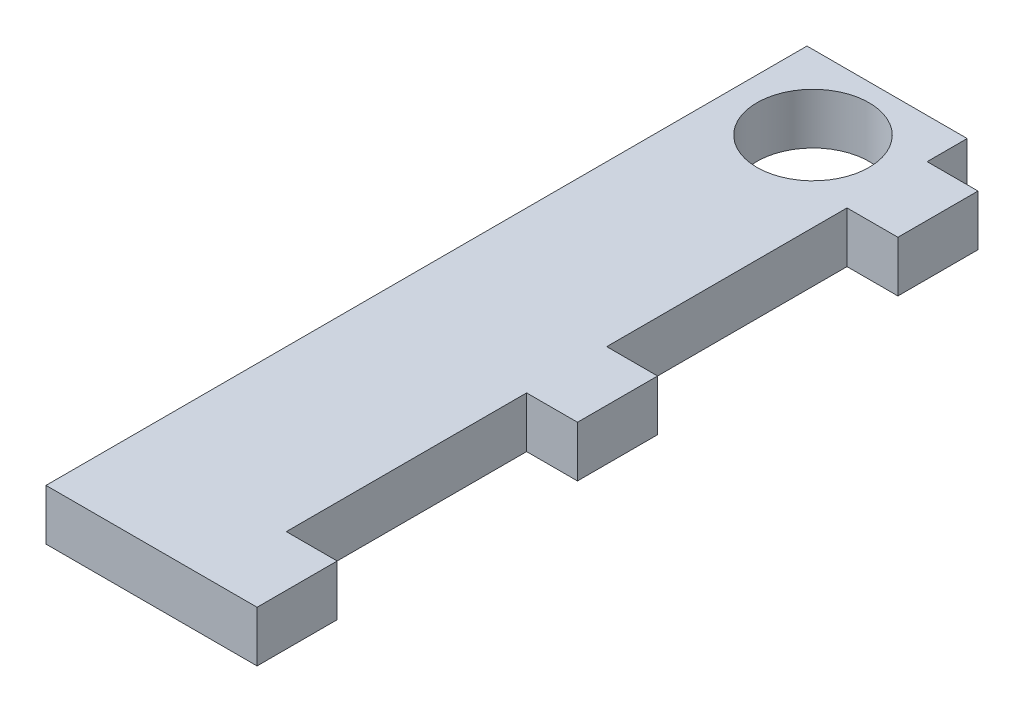
ISO-10303-21;
HEADER;
FILE_DESCRIPTION(('STEP AP214'),'2;1');
FILE_NAME('part.step','',(''),(''),'','','');
FILE_SCHEMA(('AUTOMOTIVE_DESIGN { 1 0 10303 214 1 1 1 1 }'));
ENDSEC;
DATA;
#1=APPLICATION_CONTEXT('core data for automotive mechanical design processes');
#2=APPLICATION_PROTOCOL_DEFINITION('international standard','automotive_design',2000,#1);
#3=PRODUCT_CONTEXT('',#1,'mechanical');
#4=PRODUCT('Part','Part','',(#3));
#5=PRODUCT_RELATED_PRODUCT_CATEGORY('part','',(#4));
#6=PRODUCT_DEFINITION_FORMATION('','',#4);
#7=PRODUCT_DEFINITION_CONTEXT('part definition',#1,'design');
#8=PRODUCT_DEFINITION('design','',#6,#7);
#9=PRODUCT_DEFINITION_SHAPE('','',#8);
#10=(LENGTH_UNIT() NAMED_UNIT(*) SI_UNIT(.MILLI.,.METRE.));
#11=(NAMED_UNIT(*) PLANE_ANGLE_UNIT() SI_UNIT($,.RADIAN.));
#12=(NAMED_UNIT(*) SI_UNIT($,.STERADIAN.) SOLID_ANGLE_UNIT());
#13=UNCERTAINTY_MEASURE_WITH_UNIT(LENGTH_MEASURE(1.E-05),#10,'distance_accuracy_value','');
#14=(GEOMETRIC_REPRESENTATION_CONTEXT(3) GLOBAL_UNCERTAINTY_ASSIGNED_CONTEXT((#13)) GLOBAL_UNIT_ASSIGNED_CONTEXT((#10,
#11,#12)) REPRESENTATION_CONTEXT('',''));
#15=CARTESIAN_POINT('',(0.,0.,0.));
#16=DIRECTION('',(0.,0.,1.));
#17=DIRECTION('',(1.,0.,0.));
#18=AXIS2_PLACEMENT_3D('',#15,#16,#17);
#19=CARTESIAN_POINT('',(0.,3.175,0.));
#20=DIRECTION('',(0.,1.,0.));
#21=DIRECTION('',(0.,0.,1.));
#22=AXIS2_PLACEMENT_3D('',#19,#20,#21);
#23=PLANE('',#22);
#24=DIRECTION('',(1.,0.,0.));
#25=VECTOR('',#24,1.);
#26=CARTESIAN_POINT('',(-13.175,3.175,47.5));
#27=LINE('',#26,#25);
#28=CARTESIAN_POINT('',(-13.175,3.175,47.5));
#29=VERTEX_POINT('',#28);
#30=CARTESIAN_POINT('',(13.175,3.175,47.5));
#31=VERTEX_POINT('',#30);
#32=EDGE_CURVE('E196',#29,#31,#27,.T.);
#33=ORIENTED_EDGE('',*,*,#32,.T.);
#34=DIRECTION('',(0.,0.,-1.));
#35=VECTOR('',#34,1.);
#36=CARTESIAN_POINT('',(13.175,3.175,47.5));
#37=LINE('',#36,#35);
#38=CARTESIAN_POINT('',(13.175,3.175,37.5));
#39=VERTEX_POINT('',#38);
#40=EDGE_CURVE('E114',#31,#39,#37,.T.);
#41=ORIENTED_EDGE('',*,*,#40,.T.);
#42=DIRECTION('',(-1.,0.,0.));
#43=VECTOR('',#42,1.);
#44=CARTESIAN_POINT('',(13.175,3.175,37.5));
#45=LINE('',#44,#43);
#46=CARTESIAN_POINT('',(6.82499999999999,3.175,37.5));
#47=VERTEX_POINT('',#46);
#48=EDGE_CURVE('E229',#39,#47,#45,.T.);
#49=ORIENTED_EDGE('',*,*,#48,.T.);
#50=DIRECTION('',(0.,0.,-1.));
#51=VECTOR('',#50,1.);
#52=CARTESIAN_POINT('',(6.82499999999999,3.175,37.5));
#53=LINE('',#52,#51);
#54=CARTESIAN_POINT('',(6.82499999999999,3.175,7.49999999999999));
#55=VERTEX_POINT('',#54);
#56=EDGE_CURVE('E248',#47,#55,#53,.T.);
#57=ORIENTED_EDGE('',*,*,#56,.T.);
#58=DIRECTION('',(1.,0.,0.));
#59=VECTOR('',#58,1.);
#60=CARTESIAN_POINT('',(6.82499999999999,3.175,7.49999999999999));
#61=LINE('',#60,#59);
#62=CARTESIAN_POINT('',(13.175,3.175,7.49999999999999));
#63=VERTEX_POINT('',#62);
#64=EDGE_CURVE('E245',#55,#63,#61,.T.);
#65=ORIENTED_EDGE('',*,*,#64,.T.);
#66=DIRECTION('',(0.,0.,-1.));
#67=VECTOR('',#66,1.);
#68=CARTESIAN_POINT('',(13.175,3.175,7.49999999999999));
#69=LINE('',#68,#67);
#70=CARTESIAN_POINT('',(13.175,3.175,-2.50000000000002));
#71=VERTEX_POINT('',#70);
#72=EDGE_CURVE('E247',#63,#71,#69,.T.);
#73=ORIENTED_EDGE('',*,*,#72,.T.);
#74=DIRECTION('',(-1.,0.,0.));
#75=VECTOR('',#74,1.);
#76=CARTESIAN_POINT('',(13.175,3.175,-2.50000000000002));
#77=LINE('',#76,#75);
#78=CARTESIAN_POINT('',(6.82499999999999,3.175,-2.50000000000002));
#79=VERTEX_POINT('',#78);
#80=EDGE_CURVE('E250',#71,#79,#77,.T.);
#81=ORIENTED_EDGE('',*,*,#80,.T.);
#82=DIRECTION('',(0.,0.,-1.));
#83=VECTOR('',#82,1.);
#84=CARTESIAN_POINT('',(6.82499999999999,3.175,-2.50000000000002));
#85=LINE('',#84,#83);
#86=CARTESIAN_POINT('',(6.82499999999999,3.175,-32.5));
#87=VERTEX_POINT('',#86);
#88=EDGE_CURVE('E256',#79,#87,#85,.T.);
#89=ORIENTED_EDGE('',*,*,#88,.T.);
#90=DIRECTION('',(1.,0.,0.));
#91=VECTOR('',#90,1.);
#92=CARTESIAN_POINT('',(6.82499999999999,3.175,-32.5));
#93=LINE('',#92,#91);
#94=CARTESIAN_POINT('',(13.175,3.175,-32.5));
#95=VERTEX_POINT('',#94);
#96=EDGE_CURVE('E258',#87,#95,#93,.T.);
#97=ORIENTED_EDGE('',*,*,#96,.T.);
#98=DIRECTION('',(0.,0.,-1.));
#99=VECTOR('',#98,1.);
#100=CARTESIAN_POINT('',(13.175,3.175,-32.5));
#101=LINE('',#100,#99);
#102=CARTESIAN_POINT('',(13.175,3.175,-42.5));
#103=VERTEX_POINT('',#102);
#104=EDGE_CURVE('E260',#95,#103,#101,.T.);
#105=ORIENTED_EDGE('',*,*,#104,.T.);
#106=DIRECTION('',(-1.,0.,0.));
#107=VECTOR('',#106,1.);
#108=CARTESIAN_POINT('',(13.175,3.175,-42.5));
#109=LINE('',#108,#107);
#110=CARTESIAN_POINT('',(6.82499999999999,3.175,-42.5));
#111=VERTEX_POINT('',#110);
#112=EDGE_CURVE('E151',#103,#111,#109,.T.);
#113=ORIENTED_EDGE('',*,*,#112,.T.);
#114=DIRECTION('',(0.,0.,-1.));
#115=VECTOR('',#114,1.);
#116=CARTESIAN_POINT('',(6.82499999999999,3.175,-42.5));
#117=LINE('',#116,#115);
#118=CARTESIAN_POINT('',(6.82499999999999,3.175,-47.5));
#119=VERTEX_POINT('',#118);
#120=EDGE_CURVE('E145',#111,#119,#117,.T.);
#121=ORIENTED_EDGE('',*,*,#120,.T.);
#122=DIRECTION('',(-1.,0.,0.));
#123=VECTOR('',#122,1.);
#124=CARTESIAN_POINT('',(6.82499999999999,3.175,-47.5));
#125=LINE('',#124,#123);
#126=CARTESIAN_POINT('',(-13.175,3.175,-47.5));
#127=VERTEX_POINT('',#126);
#128=EDGE_CURVE('E149',#119,#127,#125,.T.);
#129=ORIENTED_EDGE('',*,*,#128,.T.);
#130=DIRECTION('',(0.,0.,1.));
#131=VECTOR('',#130,1.);
#132=CARTESIAN_POINT('',(-13.175,3.175,-47.5));
#133=LINE('',#132,#131);
#134=EDGE_CURVE('E53',#127,#29,#133,.T.);
#135=ORIENTED_EDGE('',*,*,#134,.T.);
#136=EDGE_LOOP('',(#33,#41,#49,#57,#65,#73,#81,#89,#97,#105,#113,#121,#129,#135));
#137=FACE_BOUND('',#136,.T.);
#138=CARTESIAN_POINT('',(-3.17500000000001,3.175,-38.25));
#139=DIRECTION('',(0.,1.,0.));
#140=DIRECTION('',(0.,0.,1.));
#141=AXIS2_PLACEMENT_3D('',#138,#139,#140);
#142=CIRCLE('',#141,7.);
#143=CARTESIAN_POINT('',(-3.17500000000001,3.175,-31.25));
#144=VERTEX_POINT('',#143);
#145=EDGE_CURVE('E173',#144,#144,#142,.T.);
#146=ORIENTED_EDGE('',*,*,#145,.F.);
#147=EDGE_LOOP('',(#146));
#148=FACE_BOUND('',#147,.T.);
#149=ADVANCED_FACE('F36',(#137,#148),#23,.T.);
#150=CARTESIAN_POINT('',(0.,-3.175,0.));
#151=DIRECTION('',(0.,1.,0.));
#152=DIRECTION('',(0.,0.,1.));
#153=AXIS2_PLACEMENT_3D('',#150,#151,#152);
#154=PLANE('',#153);
#155=DIRECTION('',(1.,0.,0.));
#156=VECTOR('',#155,1.);
#157=CARTESIAN_POINT('',(-13.175,-3.175,47.5));
#158=LINE('',#157,#156);
#159=CARTESIAN_POINT('',(-13.175,-3.175,47.5));
#160=VERTEX_POINT('',#159);
#161=CARTESIAN_POINT('',(13.175,-3.175,47.5));
#162=VERTEX_POINT('',#161);
#163=EDGE_CURVE('E169',#160,#162,#158,.T.);
#164=ORIENTED_EDGE('',*,*,#163,.F.);
#165=DIRECTION('',(0.,0.,1.));
#166=VECTOR('',#165,1.);
#167=CARTESIAN_POINT('',(-13.175,-3.175,-47.5));
#168=LINE('',#167,#166);
#169=CARTESIAN_POINT('',(-13.175,-3.175,-47.5));
#170=VERTEX_POINT('',#169);
#171=EDGE_CURVE('E106',#170,#160,#168,.T.);
#172=ORIENTED_EDGE('',*,*,#171,.F.);
#173=DIRECTION('',(-1.,0.,0.));
#174=VECTOR('',#173,1.);
#175=CARTESIAN_POINT('',(6.82499999999999,-3.175,-47.5));
#176=LINE('',#175,#174);
#177=CARTESIAN_POINT('',(6.82499999999999,-3.175,-47.5));
#178=VERTEX_POINT('',#177);
#179=EDGE_CURVE('E100',#178,#170,#176,.T.);
#180=ORIENTED_EDGE('',*,*,#179,.F.);
#181=DIRECTION('',(0.,0.,-1.));
#182=VECTOR('',#181,1.);
#183=CARTESIAN_POINT('',(6.82499999999999,-3.175,-42.5));
#184=LINE('',#183,#182);
#185=CARTESIAN_POINT('',(6.82499999999999,-3.175,-42.5));
#186=VERTEX_POINT('',#185);
#187=EDGE_CURVE('E159',#186,#178,#184,.T.);
#188=ORIENTED_EDGE('',*,*,#187,.F.);
#189=DIRECTION('',(-1.,0.,0.));
#190=VECTOR('',#189,1.);
#191=CARTESIAN_POINT('',(13.175,-3.175,-42.5));
#192=LINE('',#191,#190);
#193=CARTESIAN_POINT('',(13.175,-3.175,-42.5));
#194=VERTEX_POINT('',#193);
#195=EDGE_CURVE('E191',#194,#186,#192,.T.);
#196=ORIENTED_EDGE('',*,*,#195,.F.);
#197=DIRECTION('',(0.,0.,-1.));
#198=VECTOR('',#197,1.);
#199=CARTESIAN_POINT('',(13.175,-3.175,-32.5));
#200=LINE('',#199,#198);
#201=CARTESIAN_POINT('',(13.175,-3.175,-32.5));
#202=VERTEX_POINT('',#201);
#203=EDGE_CURVE('E189',#202,#194,#200,.T.);
#204=ORIENTED_EDGE('',*,*,#203,.F.);
#205=DIRECTION('',(1.,0.,0.));
#206=VECTOR('',#205,1.);
#207=CARTESIAN_POINT('',(6.82499999999999,-3.175,-32.5));
#208=LINE('',#207,#206);
#209=CARTESIAN_POINT('',(6.82499999999999,-3.175,-32.5));
#210=VERTEX_POINT('',#209);
#211=EDGE_CURVE('E187',#210,#202,#208,.T.);
#212=ORIENTED_EDGE('',*,*,#211,.F.);
#213=DIRECTION('',(0.,0.,-1.));
#214=VECTOR('',#213,1.);
#215=CARTESIAN_POINT('',(6.82499999999999,-3.175,-2.50000000000002));
#216=LINE('',#215,#214);
#217=CARTESIAN_POINT('',(6.82499999999999,-3.175,-2.50000000000002));
#218=VERTEX_POINT('',#217);
#219=EDGE_CURVE('E185',#218,#210,#216,.T.);
#220=ORIENTED_EDGE('',*,*,#219,.F.);
#221=DIRECTION('',(-1.,0.,0.));
#222=VECTOR('',#221,1.);
#223=CARTESIAN_POINT('',(13.175,-3.175,-2.50000000000002));
#224=LINE('',#223,#222);
#225=CARTESIAN_POINT('',(13.175,-3.175,-2.50000000000002));
#226=VERTEX_POINT('',#225);
#227=EDGE_CURVE('E183',#226,#218,#224,.T.);
#228=ORIENTED_EDGE('',*,*,#227,.F.);
#229=DIRECTION('',(0.,0.,-1.));
#230=VECTOR('',#229,1.);
#231=CARTESIAN_POINT('',(13.175,-3.175,7.49999999999999));
#232=LINE('',#231,#230);
#233=CARTESIAN_POINT('',(13.175,-3.175,7.49999999999999));
#234=VERTEX_POINT('',#233);
#235=EDGE_CURVE('E181',#234,#226,#232,.T.);
#236=ORIENTED_EDGE('',*,*,#235,.F.);
#237=DIRECTION('',(1.,0.,0.));
#238=VECTOR('',#237,1.);
#239=CARTESIAN_POINT('',(6.82499999999999,-3.175,7.49999999999999));
#240=LINE('',#239,#238);
#241=CARTESIAN_POINT('',(6.82499999999999,-3.175,7.49999999999999));
#242=VERTEX_POINT('',#241);
#243=EDGE_CURVE('E179',#242,#234,#240,.T.);
#244=ORIENTED_EDGE('',*,*,#243,.F.);
#245=DIRECTION('',(0.,0.,-1.));
#246=VECTOR('',#245,1.);
#247=CARTESIAN_POINT('',(6.82499999999999,-3.175,37.5));
#248=LINE('',#247,#246);
#249=CARTESIAN_POINT('',(6.82499999999999,-3.175,37.5));
#250=VERTEX_POINT('',#249);
#251=EDGE_CURVE('E177',#250,#242,#248,.T.);
#252=ORIENTED_EDGE('',*,*,#251,.F.);
#253=DIRECTION('',(-1.,0.,0.));
#254=VECTOR('',#253,1.);
#255=CARTESIAN_POINT('',(13.175,-3.175,37.5));
#256=LINE('',#255,#254);
#257=CARTESIAN_POINT('',(13.175,-3.175,37.5));
#258=VERTEX_POINT('',#257);
#259=EDGE_CURVE('E175',#258,#250,#256,.T.);
#260=ORIENTED_EDGE('',*,*,#259,.F.);
#261=DIRECTION('',(0.,0.,-1.));
#262=VECTOR('',#261,1.);
#263=CARTESIAN_POINT('',(13.175,-3.175,47.5));
#264=LINE('',#263,#262);
#265=EDGE_CURVE('E172',#162,#258,#264,.T.);
#266=ORIENTED_EDGE('',*,*,#265,.F.);
#267=EDGE_LOOP('',(#164,#172,#180,#188,#196,#204,#212,#220,#228,#236,#244,#252,#260,#266));
#268=FACE_BOUND('',#267,.T.);
#269=CARTESIAN_POINT('',(-3.17500000000001,-3.175,-38.25));
#270=DIRECTION('',(0.,1.,0.));
#271=DIRECTION('',(0.,0.,1.));
#272=AXIS2_PLACEMENT_3D('',#269,#270,#271);
#273=CIRCLE('',#272,7.);
#274=CARTESIAN_POINT('',(-3.17500000000001,-3.175,-31.25));
#275=VERTEX_POINT('',#274);
#276=EDGE_CURVE('E433',#275,#275,#273,.T.);
#277=ORIENTED_EDGE('',*,*,#276,.T.);
#278=EDGE_LOOP('',(#277));
#279=FACE_BOUND('',#278,.T.);
#280=ADVANCED_FACE('F233',(#268,#279),#154,.F.);
#281=CARTESIAN_POINT('',(-13.175,3.175,47.5));
#282=DIRECTION('',(0.,0.,-1.));
#283=DIRECTION('',(-1.,0.,0.));
#284=AXIS2_PLACEMENT_3D('',#281,#282,#283);
#285=PLANE('',#284);
#286=ORIENTED_EDGE('',*,*,#163,.T.);
#287=DIRECTION('',(0.,-1.,0.));
#288=VECTOR('',#287,1.);
#289=CARTESIAN_POINT('',(13.175,3.175,47.5));
#290=LINE('',#289,#288);
#291=EDGE_CURVE('E11',#31,#162,#290,.T.);
#292=ORIENTED_EDGE('',*,*,#291,.F.);
#293=ORIENTED_EDGE('',*,*,#32,.F.);
#294=DIRECTION('',(0.,-1.,0.));
#295=VECTOR('',#294,1.);
#296=CARTESIAN_POINT('',(-13.175,3.175,47.5));
#297=LINE('',#296,#295);
#298=EDGE_CURVE('E165',#29,#160,#297,.T.);
#299=ORIENTED_EDGE('',*,*,#298,.T.);
#300=EDGE_LOOP('',(#286,#292,#293,#299));
#301=FACE_BOUND('',#300,.T.);
#302=ADVANCED_FACE('F38',(#301),#285,.F.);
#303=CARTESIAN_POINT('',(13.175,3.175,47.5));
#304=DIRECTION('',(-1.,0.,0.));
#305=DIRECTION('',(0.,0.,1.));
#306=AXIS2_PLACEMENT_3D('',#303,#304,#305);
#307=PLANE('',#306);
#308=ORIENTED_EDGE('',*,*,#265,.T.);
#309=DIRECTION('',(0.,-1.,0.));
#310=VECTOR('',#309,1.);
#311=CARTESIAN_POINT('',(13.175,3.175,37.5));
#312=LINE('',#311,#310);
#313=EDGE_CURVE('E45',#39,#258,#312,.T.);
#314=ORIENTED_EDGE('',*,*,#313,.F.);
#315=ORIENTED_EDGE('',*,*,#40,.F.);
#316=ORIENTED_EDGE('',*,*,#291,.T.);
#317=EDGE_LOOP('',(#308,#314,#315,#316));
#318=FACE_BOUND('',#317,.T.);
#319=ADVANCED_FACE('F294',(#318),#307,.F.);
#320=CARTESIAN_POINT('',(13.175,3.175,37.5));
#321=DIRECTION('',(0.,0.,1.));
#322=DIRECTION('',(1.,0.,0.));
#323=AXIS2_PLACEMENT_3D('',#320,#321,#322);
#324=PLANE('',#323);
#325=ORIENTED_EDGE('',*,*,#259,.T.);
#326=DIRECTION('',(0.,-1.,0.));
#327=VECTOR('',#326,1.);
#328=CARTESIAN_POINT('',(6.82499999999999,3.175,37.5));
#329=LINE('',#328,#327);
#330=EDGE_CURVE('E221',#47,#250,#329,.T.);
#331=ORIENTED_EDGE('',*,*,#330,.F.);
#332=ORIENTED_EDGE('',*,*,#48,.F.);
#333=ORIENTED_EDGE('',*,*,#313,.T.);
#334=EDGE_LOOP('',(#325,#331,#332,#333));
#335=FACE_BOUND('',#334,.T.);
#336=ADVANCED_FACE('F227',(#335),#324,.F.);
#337=CARTESIAN_POINT('',(6.82499999999999,3.175,37.5));
#338=DIRECTION('',(-1.,0.,0.));
#339=DIRECTION('',(0.,0.,1.));
#340=AXIS2_PLACEMENT_3D('',#337,#338,#339);
#341=PLANE('',#340);
#342=ORIENTED_EDGE('',*,*,#251,.T.);
#343=DIRECTION('',(0.,-1.,0.));
#344=VECTOR('',#343,1.);
#345=CARTESIAN_POINT('',(6.82499999999999,3.175,7.49999999999999));
#346=LINE('',#345,#344);
#347=EDGE_CURVE('E218',#55,#242,#346,.T.);
#348=ORIENTED_EDGE('',*,*,#347,.F.);
#349=ORIENTED_EDGE('',*,*,#56,.F.);
#350=ORIENTED_EDGE('',*,*,#330,.T.);
#351=EDGE_LOOP('',(#342,#348,#349,#350));
#352=FACE_BOUND('',#351,.T.);
#353=ADVANCED_FACE('F239',(#352),#341,.F.);
#354=CARTESIAN_POINT('',(6.82499999999999,3.175,7.49999999999999));
#355=DIRECTION('',(0.,0.,-1.));
#356=DIRECTION('',(-1.,0.,0.));
#357=AXIS2_PLACEMENT_3D('',#354,#355,#356);
#358=PLANE('',#357);
#359=ORIENTED_EDGE('',*,*,#243,.T.);
#360=DIRECTION('',(0.,-1.,0.));
#361=VECTOR('',#360,1.);
#362=CARTESIAN_POINT('',(13.175,3.175,7.49999999999999));
#363=LINE('',#362,#361);
#364=EDGE_CURVE('E215',#63,#234,#363,.T.);
#365=ORIENTED_EDGE('',*,*,#364,.F.);
#366=ORIENTED_EDGE('',*,*,#64,.F.);
#367=ORIENTED_EDGE('',*,*,#347,.T.);
#368=EDGE_LOOP('',(#359,#365,#366,#367));
#369=FACE_BOUND('',#368,.T.);
#370=ADVANCED_FACE('F243',(#369),#358,.F.);
#371=CARTESIAN_POINT('',(13.175,3.175,7.49999999999999));
#372=DIRECTION('',(-1.,0.,0.));
#373=DIRECTION('',(0.,0.,1.));
#374=AXIS2_PLACEMENT_3D('',#371,#372,#373);
#375=PLANE('',#374);
#376=ORIENTED_EDGE('',*,*,#235,.T.);
#377=DIRECTION('',(0.,-1.,0.));
#378=VECTOR('',#377,1.);
#379=CARTESIAN_POINT('',(13.175,3.175,-2.50000000000002));
#380=LINE('',#379,#378);
#381=EDGE_CURVE('E212',#71,#226,#380,.T.);
#382=ORIENTED_EDGE('',*,*,#381,.F.);
#383=ORIENTED_EDGE('',*,*,#72,.F.);
#384=ORIENTED_EDGE('',*,*,#364,.T.);
#385=EDGE_LOOP('',(#376,#382,#383,#384));
#386=FACE_BOUND('',#385,.T.);
#387=ADVANCED_FACE('F307',(#386),#375,.F.);
#388=CARTESIAN_POINT('',(13.175,3.175,-2.50000000000002));
#389=DIRECTION('',(0.,0.,1.));
#390=DIRECTION('',(1.,0.,0.));
#391=AXIS2_PLACEMENT_3D('',#388,#389,#390);
#392=PLANE('',#391);
#393=ORIENTED_EDGE('',*,*,#227,.T.);
#394=DIRECTION('',(0.,-1.,0.));
#395=VECTOR('',#394,1.);
#396=CARTESIAN_POINT('',(6.82499999999999,3.175,-2.50000000000002));
#397=LINE('',#396,#395);
#398=EDGE_CURVE('E209',#79,#218,#397,.T.);
#399=ORIENTED_EDGE('',*,*,#398,.F.);
#400=ORIENTED_EDGE('',*,*,#80,.F.);
#401=ORIENTED_EDGE('',*,*,#381,.T.);
#402=EDGE_LOOP('',(#393,#399,#400,#401));
#403=FACE_BOUND('',#402,.T.);
#404=ADVANCED_FACE('F310',(#403),#392,.F.);
#405=CARTESIAN_POINT('',(6.82499999999999,3.175,-2.50000000000002));
#406=DIRECTION('',(-1.,0.,0.));
#407=DIRECTION('',(0.,0.,1.));
#408=AXIS2_PLACEMENT_3D('',#405,#406,#407);
#409=PLANE('',#408);
#410=ORIENTED_EDGE('',*,*,#219,.T.);
#411=DIRECTION('',(0.,-1.,0.));
#412=VECTOR('',#411,1.);
#413=CARTESIAN_POINT('',(6.82499999999999,3.175,-32.5));
#414=LINE('',#413,#412);
#415=EDGE_CURVE('E206',#87,#210,#414,.T.);
#416=ORIENTED_EDGE('',*,*,#415,.F.);
#417=ORIENTED_EDGE('',*,*,#88,.F.);
#418=ORIENTED_EDGE('',*,*,#398,.T.);
#419=EDGE_LOOP('',(#410,#416,#417,#418));
#420=FACE_BOUND('',#419,.T.);
#421=ADVANCED_FACE('F314',(#420),#409,.F.);
#422=CARTESIAN_POINT('',(6.82499999999999,3.175,-32.5));
#423=DIRECTION('',(0.,0.,-1.));
#424=DIRECTION('',(-1.,0.,0.));
#425=AXIS2_PLACEMENT_3D('',#422,#423,#424);
#426=PLANE('',#425);
#427=ORIENTED_EDGE('',*,*,#211,.T.);
#428=DIRECTION('',(0.,-1.,0.));
#429=VECTOR('',#428,1.);
#430=CARTESIAN_POINT('',(13.175,3.175,-32.5));
#431=LINE('',#430,#429);
#432=EDGE_CURVE('E203',#95,#202,#431,.T.);
#433=ORIENTED_EDGE('',*,*,#432,.F.);
#434=ORIENTED_EDGE('',*,*,#96,.F.);
#435=ORIENTED_EDGE('',*,*,#415,.T.);
#436=EDGE_LOOP('',(#427,#433,#434,#435));
#437=FACE_BOUND('',#436,.T.);
#438=ADVANCED_FACE('F318',(#437),#426,.F.);
#439=CARTESIAN_POINT('',(13.175,3.175,-32.5));
#440=DIRECTION('',(-1.,0.,0.));
#441=DIRECTION('',(0.,0.,1.));
#442=AXIS2_PLACEMENT_3D('',#439,#440,#441);
#443=PLANE('',#442);
#444=ORIENTED_EDGE('',*,*,#203,.T.);
#445=DIRECTION('',(0.,-1.,0.));
#446=VECTOR('',#445,1.);
#447=CARTESIAN_POINT('',(13.175,3.175,-42.5));
#448=LINE('',#447,#446);
#449=EDGE_CURVE('E200',#103,#194,#448,.T.);
#450=ORIENTED_EDGE('',*,*,#449,.F.);
#451=ORIENTED_EDGE('',*,*,#104,.F.);
#452=ORIENTED_EDGE('',*,*,#432,.T.);
#453=EDGE_LOOP('',(#444,#450,#451,#452));
#454=FACE_BOUND('',#453,.T.);
#455=ADVANCED_FACE('F266',(#454),#443,.F.);
#456=CARTESIAN_POINT('',(13.175,3.175,-42.5));
#457=DIRECTION('',(0.,0.,1.));
#458=DIRECTION('',(1.,0.,0.));
#459=AXIS2_PLACEMENT_3D('',#456,#457,#458);
#460=PLANE('',#459);
#461=ORIENTED_EDGE('',*,*,#195,.T.);
#462=DIRECTION('',(0.,-1.,0.));
#463=VECTOR('',#462,1.);
#464=CARTESIAN_POINT('',(6.82499999999999,3.175,-42.5));
#465=LINE('',#464,#463);
#466=EDGE_CURVE('E160',#111,#186,#465,.T.);
#467=ORIENTED_EDGE('',*,*,#466,.F.);
#468=ORIENTED_EDGE('',*,*,#112,.F.);
#469=ORIENTED_EDGE('',*,*,#449,.T.);
#470=EDGE_LOOP('',(#461,#467,#468,#469));
#471=FACE_BOUND('',#470,.T.);
#472=ADVANCED_FACE('F270',(#471),#460,.F.);
#473=CARTESIAN_POINT('',(6.82499999999999,3.175,-42.5));
#474=DIRECTION('',(-1.,0.,0.));
#475=DIRECTION('',(0.,0.,1.));
#476=AXIS2_PLACEMENT_3D('',#473,#474,#475);
#477=PLANE('',#476);
#478=ORIENTED_EDGE('',*,*,#187,.T.);
#479=DIRECTION('',(0.,-1.,0.));
#480=VECTOR('',#479,1.);
#481=CARTESIAN_POINT('',(6.82499999999999,3.175,-47.5));
#482=LINE('',#481,#480);
#483=EDGE_CURVE('E156',#119,#178,#482,.T.);
#484=ORIENTED_EDGE('',*,*,#483,.F.);
#485=ORIENTED_EDGE('',*,*,#120,.F.);
#486=ORIENTED_EDGE('',*,*,#466,.T.);
#487=EDGE_LOOP('',(#478,#484,#485,#486));
#488=FACE_BOUND('',#487,.T.);
#489=ADVANCED_FACE('F157',(#488),#477,.F.);
#490=CARTESIAN_POINT('',(6.82499999999999,3.175,-47.5));
#491=DIRECTION('',(0.,0.,1.));
#492=DIRECTION('',(1.,0.,0.));
#493=AXIS2_PLACEMENT_3D('',#490,#491,#492);
#494=PLANE('',#493);
#495=ORIENTED_EDGE('',*,*,#179,.T.);
#496=DIRECTION('',(0.,-1.,0.));
#497=VECTOR('',#496,1.);
#498=CARTESIAN_POINT('',(-13.175,3.175,-47.5));
#499=LINE('',#498,#497);
#500=EDGE_CURVE('E161',#127,#170,#499,.T.);
#501=ORIENTED_EDGE('',*,*,#500,.F.);
#502=ORIENTED_EDGE('',*,*,#128,.F.);
#503=ORIENTED_EDGE('',*,*,#483,.T.);
#504=EDGE_LOOP('',(#495,#501,#502,#503));
#505=FACE_BOUND('',#504,.T.);
#506=ADVANCED_FACE('F163',(#505),#494,.F.);
#507=CARTESIAN_POINT('',(-13.175,3.175,-47.5));
#508=DIRECTION('',(1.,0.,0.));
#509=DIRECTION('',(0.,0.,-1.));
#510=AXIS2_PLACEMENT_3D('',#507,#508,#509);
#511=PLANE('',#510);
#512=ORIENTED_EDGE('',*,*,#171,.T.);
#513=ORIENTED_EDGE('',*,*,#298,.F.);
#514=ORIENTED_EDGE('',*,*,#134,.F.);
#515=ORIENTED_EDGE('',*,*,#500,.T.);
#516=EDGE_LOOP('',(#512,#513,#514,#515));
#517=FACE_BOUND('',#516,.T.);
#518=ADVANCED_FACE('F274',(#517),#511,.F.);
#519=CARTESIAN_POINT('',(-3.17500000000001,3.175,-38.25));
#520=DIRECTION('',(0.,-1.,0.));
#521=DIRECTION('',(0.,0.,-1.));
#522=AXIS2_PLACEMENT_3D('',#519,#520,#521);
#523=CYLINDRICAL_SURFACE('',#522,7.);
#524=ORIENTED_EDGE('',*,*,#145,.T.);
#525=EDGE_LOOP('',(#524));
#526=FACE_BOUND('',#525,.T.);
#527=ORIENTED_EDGE('',*,*,#276,.F.);
#528=EDGE_LOOP('',(#527));
#529=FACE_BOUND('',#528,.T.);
#530=ADVANCED_FACE('F276',(#526,#529),#523,.F.);
#531=CLOSED_SHELL('',(#149,#280,#302,#319,#336,#353,#370,#387,#404,#421,#438,#455,#472,#489,
#506,#518,#530));
#532=MANIFOLD_SOLID_BREP('B2',#531);
#533=ADVANCED_BREP_SHAPE_REPRESENTATION('',(#18,#532),#14);
#534=SHAPE_DEFINITION_REPRESENTATION(#9,#533);
ENDSEC;
END-ISO-10303-21;
